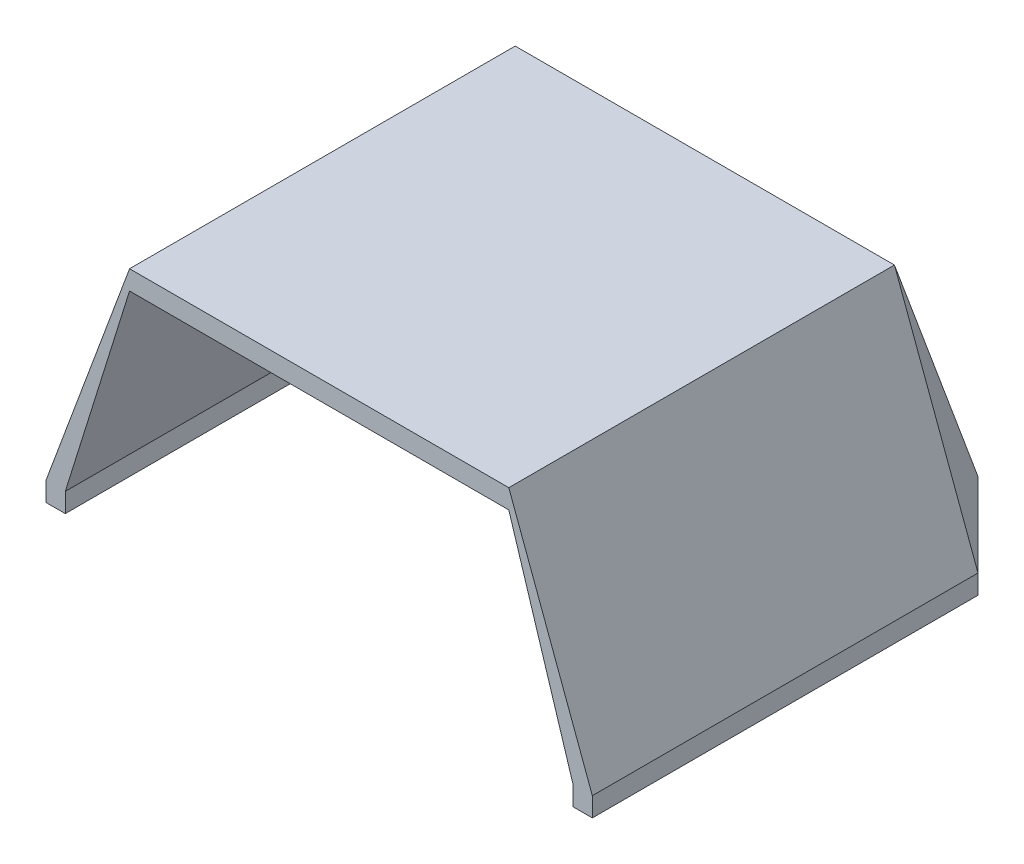
ISO-10303-21;
HEADER;
FILE_DESCRIPTION(('STEP AP214'),'2;1');
FILE_NAME('part.step','',(''),(''),'','','');
FILE_SCHEMA(('AUTOMOTIVE_DESIGN { 1 0 10303 214 1 1 1 1 }'));
ENDSEC;
DATA;
#1=APPLICATION_CONTEXT('core data for automotive mechanical design processes');
#2=APPLICATION_PROTOCOL_DEFINITION('international standard','automotive_design',2000,#1);
#3=PRODUCT_CONTEXT('',#1,'mechanical');
#4=PRODUCT('Part','Part','',(#3));
#5=PRODUCT_RELATED_PRODUCT_CATEGORY('part','',(#4));
#6=PRODUCT_DEFINITION_FORMATION('','',#4);
#7=PRODUCT_DEFINITION_CONTEXT('part definition',#1,'design');
#8=PRODUCT_DEFINITION('design','',#6,#7);
#9=PRODUCT_DEFINITION_SHAPE('','',#8);
#10=(LENGTH_UNIT() NAMED_UNIT(*) SI_UNIT(.MILLI.,.METRE.));
#11=(NAMED_UNIT(*) PLANE_ANGLE_UNIT() SI_UNIT($,.RADIAN.));
#12=(NAMED_UNIT(*) SI_UNIT($,.STERADIAN.) SOLID_ANGLE_UNIT());
#13=UNCERTAINTY_MEASURE_WITH_UNIT(LENGTH_MEASURE(1.E-05),#10,'distance_accuracy_value','');
#14=(GEOMETRIC_REPRESENTATION_CONTEXT(3) GLOBAL_UNCERTAINTY_ASSIGNED_CONTEXT((#13)) GLOBAL_UNIT_ASSIGNED_CONTEXT((#10,
#11,#12)) REPRESENTATION_CONTEXT('',''));
#15=CARTESIAN_POINT('',(0.,0.,0.));
#16=DIRECTION('',(0.,0.,1.));
#17=DIRECTION('',(1.,0.,0.));
#18=AXIS2_PLACEMENT_3D('',#15,#16,#17);
#19=CARTESIAN_POINT('',(0.,3.,-70.));
#20=DIRECTION('',(0.,0.,-1.));
#21=DIRECTION('',(-1.,0.,0.));
#22=AXIS2_PLACEMENT_3D('',#19,#20,#21);
#23=PLANE('',#22);
#24=DIRECTION('',(1.,0.,0.));
#25=VECTOR('',#24,1.);
#26=CARTESIAN_POINT('',(0.,0.,-70.));
#27=LINE('',#26,#25);
#28=CARTESIAN_POINT('',(0.,0.,-70.));
#29=VERTEX_POINT('',#28);
#30=CARTESIAN_POINT('',(59.,0.,-70.));
#31=VERTEX_POINT('',#30);
#32=EDGE_CURVE('E110',#29,#31,#27,.T.);
#33=ORIENTED_EDGE('',*,*,#32,.T.);
#34=DIRECTION('',(0.,-1.,0.));
#35=VECTOR('',#34,1.);
#36=CARTESIAN_POINT('',(59.,3.,-70.));
#37=LINE('',#36,#35);
#38=CARTESIAN_POINT('',(59.,3.,-70.));
#39=VERTEX_POINT('',#38);
#40=EDGE_CURVE('E12',#39,#31,#37,.T.);
#41=ORIENTED_EDGE('',*,*,#40,.F.);
#42=DIRECTION('',(1.,0.,0.));
#43=VECTOR('',#42,1.);
#44=CARTESIAN_POINT('',(0.,3.,-70.));
#45=LINE('',#44,#43);
#46=CARTESIAN_POINT('',(0.,3.,-70.));
#47=VERTEX_POINT('',#46);
#48=EDGE_CURVE('E109',#47,#39,#45,.T.);
#49=ORIENTED_EDGE('',*,*,#48,.F.);
#50=DIRECTION('',(0.,-1.,0.));
#51=VECTOR('',#50,1.);
#52=CARTESIAN_POINT('',(0.,3.,-70.));
#53=LINE('',#52,#51);
#54=EDGE_CURVE('E122',#47,#29,#53,.T.);
#55=ORIENTED_EDGE('',*,*,#54,.T.);
#56=EDGE_LOOP('',(#33,#41,#49,#55));
#57=FACE_BOUND('',#56,.T.);
#58=ADVANCED_FACE('F63',(#57),#23,.F.);
#59=CARTESIAN_POINT('',(0.,3.,-73.));
#60=DIRECTION('',(0.,0.,-1.));
#61=DIRECTION('',(-1.,0.,0.));
#62=AXIS2_PLACEMENT_3D('',#59,#60,#61);
#63=PLANE('',#62);
#64=DIRECTION('',(1.,0.,0.));
#65=VECTOR('',#64,1.);
#66=CARTESIAN_POINT('',(0.,0.,-73.));
#67=LINE('',#66,#65);
#68=CARTESIAN_POINT('',(0.,0.,-73.));
#69=VERTEX_POINT('',#68);
#70=CARTESIAN_POINT('',(59.,0.,-73.));
#71=VERTEX_POINT('',#70);
#72=EDGE_CURVE('E98',#69,#71,#67,.T.);
#73=ORIENTED_EDGE('',*,*,#72,.F.);
#74=DIRECTION('',(0.,-1.,0.));
#75=VECTOR('',#74,1.);
#76=CARTESIAN_POINT('',(0.,3.,-73.));
#77=LINE('',#76,#75);
#78=CARTESIAN_POINT('',(0.,3.,-73.));
#79=VERTEX_POINT('',#78);
#80=EDGE_CURVE('E101',#79,#69,#77,.T.);
#81=ORIENTED_EDGE('',*,*,#80,.F.);
#82=DIRECTION('',(1.,0.,0.));
#83=VECTOR('',#82,1.);
#84=CARTESIAN_POINT('',(0.,3.,-73.));
#85=LINE('',#84,#83);
#86=CARTESIAN_POINT('',(59.,3.,-73.));
#87=VERTEX_POINT('',#86);
#88=EDGE_CURVE('E81',#79,#87,#85,.T.);
#89=ORIENTED_EDGE('',*,*,#88,.T.);
#90=DIRECTION('',(0.,-1.,0.));
#91=VECTOR('',#90,1.);
#92=CARTESIAN_POINT('',(59.,3.,-73.));
#93=LINE('',#92,#91);
#94=EDGE_CURVE('E73',#87,#71,#93,.T.);
#95=ORIENTED_EDGE('',*,*,#94,.T.);
#96=EDGE_LOOP('',(#73,#81,#89,#95));
#97=FACE_BOUND('',#96,.T.);
#98=ADVANCED_FACE('F100',(#97),#63,.T.);
#99=CARTESIAN_POINT('',(0.,0.,0.));
#100=DIRECTION('',(0.,1.,0.));
#101=DIRECTION('',(0.,0.,1.));
#102=AXIS2_PLACEMENT_3D('',#99,#100,#101);
#103=PLANE('',#102);
#104=ORIENTED_EDGE('',*,*,#32,.F.);
#105=DIRECTION('',(0.707106781186548,0.,-0.707106781186547));
#106=VECTOR('',#105,1.);
#107=CARTESIAN_POINT('',(-10.,0.,-60.));
#108=LINE('',#107,#106);
#109=CARTESIAN_POINT('',(-10.,0.,-60.));
#110=VERTEX_POINT('',#109);
#111=EDGE_CURVE('E137',#110,#29,#108,.T.);
#112=ORIENTED_EDGE('',*,*,#111,.F.);
#113=DIRECTION('',(0.,0.,-1.));
#114=VECTOR('',#113,1.);
#115=CARTESIAN_POINT('',(-10.,0.,0.));
#116=LINE('',#115,#114);
#117=CARTESIAN_POINT('',(-10.,0.,0.));
#118=VERTEX_POINT('',#117);
#119=EDGE_CURVE('E146',#118,#110,#116,.T.);
#120=ORIENTED_EDGE('',*,*,#119,.F.);
#121=DIRECTION('',(-1.,0.,0.));
#122=VECTOR('',#121,1.);
#123=CARTESIAN_POINT('',(0.,0.,0.));
#124=LINE('',#123,#122);
#125=CARTESIAN_POINT('',(-13.,0.,0.));
#126=VERTEX_POINT('',#125);
#127=EDGE_CURVE('E143',#118,#126,#124,.T.);
#128=ORIENTED_EDGE('',*,*,#127,.T.);
#129=DIRECTION('',(0.,0.,-1.));
#130=VECTOR('',#129,1.);
#131=CARTESIAN_POINT('',(-13.,0.,0.));
#132=LINE('',#131,#130);
#133=CARTESIAN_POINT('',(-13.,0.,-60.));
#134=VERTEX_POINT('',#133);
#135=EDGE_CURVE('E129',#126,#134,#132,.T.);
#136=ORIENTED_EDGE('',*,*,#135,.T.);
#137=DIRECTION('',(0.707106781186548,0.,-0.707106781186547));
#138=VECTOR('',#137,1.);
#139=CARTESIAN_POINT('',(-13.,0.,-60.));
#140=LINE('',#139,#138);
#141=EDGE_CURVE('E118',#134,#69,#140,.T.);
#142=ORIENTED_EDGE('',*,*,#141,.T.);
#143=ORIENTED_EDGE('',*,*,#72,.T.);
#144=DIRECTION('',(0.707106781186547,0.,0.707106781186547));
#145=VECTOR('',#144,1.);
#146=CARTESIAN_POINT('',(59.,0.,-73.));
#147=LINE('',#146,#145);
#148=CARTESIAN_POINT('',(72.,0.,-60.));
#149=VERTEX_POINT('',#148);
#150=EDGE_CURVE('E331',#71,#149,#147,.T.);
#151=ORIENTED_EDGE('',*,*,#150,.T.);
#152=DIRECTION('',(0.,0.,1.));
#153=VECTOR('',#152,1.);
#154=CARTESIAN_POINT('',(72.,0.,0.));
#155=LINE('',#154,#153);
#156=CARTESIAN_POINT('',(72.,0.,0.));
#157=VERTEX_POINT('',#156);
#158=EDGE_CURVE('E387',#149,#157,#155,.T.);
#159=ORIENTED_EDGE('',*,*,#158,.T.);
#160=DIRECTION('',(1.,0.,0.));
#161=VECTOR('',#160,1.);
#162=CARTESIAN_POINT('',(0.,0.,0.));
#163=LINE('',#162,#161);
#164=CARTESIAN_POINT('',(69.,0.,0.));
#165=VERTEX_POINT('',#164);
#166=EDGE_CURVE('E379',#165,#157,#163,.T.);
#167=ORIENTED_EDGE('',*,*,#166,.F.);
#168=DIRECTION('',(0.,0.,1.));
#169=VECTOR('',#168,1.);
#170=CARTESIAN_POINT('',(69.,0.,0.));
#171=LINE('',#170,#169);
#172=CARTESIAN_POINT('',(69.,0.,-60.));
#173=VERTEX_POINT('',#172);
#174=EDGE_CURVE('E465',#173,#165,#171,.T.);
#175=ORIENTED_EDGE('',*,*,#174,.F.);
#176=DIRECTION('',(0.707106781186547,0.,0.707106781186547));
#177=VECTOR('',#176,1.);
#178=CARTESIAN_POINT('',(59.,0.,-70.));
#179=LINE('',#178,#177);
#180=EDGE_CURVE('E343',#31,#173,#179,.T.);
#181=ORIENTED_EDGE('',*,*,#180,.F.);
#182=EDGE_LOOP('',(#104,#112,#120,#128,#136,#142,#143,#151,#159,#167,#175,#181));
#183=FACE_BOUND('',#182,.T.);
#184=ADVANCED_FACE('F126',(#183),#103,.F.);
#185=CARTESIAN_POINT('',(0.,24.1908177905308,-65.12912482066));
#186=DIRECTION('',(0.,-0.348186529603627,0.937425272009765));
#187=DIRECTION('',(0.,-0.937425272009766,-0.348186529603627));
#188=AXIS2_PLACEMENT_3D('',#185,#186,#187);
#189=PLANE('',#188);
#190=DIRECTION('',(0.,-0.937425272009765,-0.348186529603627));
#191=VECTOR('',#190,1.);
#192=CARTESIAN_POINT('',(59.,24.1908177905308,-65.12912482066));
#193=LINE('',#192,#191);
#194=CARTESIAN_POINT('',(59.,38.,-60.));
#195=VERTEX_POINT('',#194);
#196=EDGE_CURVE('E315',#195,#87,#193,.T.);
#197=ORIENTED_EDGE('',*,*,#196,.T.);
#198=ORIENTED_EDGE('',*,*,#88,.F.);
#199=DIRECTION('',(0.,-0.937425272009765,-0.348186529603627));
#200=VECTOR('',#199,1.);
#201=CARTESIAN_POINT('',(0.,24.1908177905308,-65.12912482066));
#202=LINE('',#201,#200);
#203=CARTESIAN_POINT('',(0.,38.,-60.));
#204=VERTEX_POINT('',#203);
#205=EDGE_CURVE('E408',#204,#79,#202,.T.);
#206=ORIENTED_EDGE('',*,*,#205,.F.);
#207=DIRECTION('',(1.,0.,0.));
#208=VECTOR('',#207,1.);
#209=CARTESIAN_POINT('',(0.,38.,-60.));
#210=LINE('',#209,#208);
#211=EDGE_CURVE('E317',#204,#195,#210,.T.);
#212=ORIENTED_EDGE('',*,*,#211,.T.);
#213=EDGE_LOOP('',(#197,#198,#206,#212));
#214=FACE_BOUND('',#213,.T.);
#215=ADVANCED_FACE('F316',(#214),#189,.F.);
#216=CARTESIAN_POINT('',(0.,20.1957295373665,-64.6263345195729));
#217=DIRECTION('',(0.,0.298274993135947,-0.95447997803503));
#218=DIRECTION('',(0.,0.95447997803503,0.298274993135947));
#219=AXIS2_PLACEMENT_3D('',#216,#217,#218);
#220=PLANE('',#219);
#221=DIRECTION('',(0.,0.95447997803503,0.298274993135947));
#222=VECTOR('',#221,1.);
#223=CARTESIAN_POINT('',(59.,20.1957295373665,-64.6263345195729));
#224=LINE('',#223,#222);
#225=CARTESIAN_POINT('',(59.,35.,-60.));
#226=VERTEX_POINT('',#225);
#227=EDGE_CURVE('E322',#39,#226,#224,.T.);
#228=ORIENTED_EDGE('',*,*,#227,.T.);
#229=DIRECTION('',(1.,0.,0.));
#230=VECTOR('',#229,1.);
#231=CARTESIAN_POINT('',(0.,35.,-60.));
#232=LINE('',#231,#230);
#233=CARTESIAN_POINT('',(0.,35.,-60.));
#234=VERTEX_POINT('',#233);
#235=EDGE_CURVE('E399',#234,#226,#232,.T.);
#236=ORIENTED_EDGE('',*,*,#235,.F.);
#237=DIRECTION('',(0.,0.95447997803503,0.298274993135947));
#238=VECTOR('',#237,1.);
#239=CARTESIAN_POINT('',(0.,20.1957295373665,-64.6263345195729));
#240=LINE('',#239,#238);
#241=EDGE_CURVE('E405',#47,#234,#240,.T.);
#242=ORIENTED_EDGE('',*,*,#241,.F.);
#243=ORIENTED_EDGE('',*,*,#48,.T.);
#244=EDGE_LOOP('',(#228,#236,#242,#243));
#245=FACE_BOUND('',#244,.T.);
#246=ADVANCED_FACE('F427',(#245),#220,.F.);
#247=CARTESIAN_POINT('',(72.,3.,0.));
#248=DIRECTION('',(1.,0.,0.));
#249=DIRECTION('',(0.,0.,-1.));
#250=AXIS2_PLACEMENT_3D('',#247,#248,#249);
#251=PLANE('',#250);
#252=ORIENTED_EDGE('',*,*,#158,.F.);
#253=DIRECTION('',(0.,-1.,0.));
#254=VECTOR('',#253,1.);
#255=CARTESIAN_POINT('',(72.,3.,-60.));
#256=LINE('',#255,#254);
#257=CARTESIAN_POINT('',(72.,3.,-60.));
#258=VERTEX_POINT('',#257);
#259=EDGE_CURVE('E323',#258,#149,#256,.T.);
#260=ORIENTED_EDGE('',*,*,#259,.F.);
#261=DIRECTION('',(0.,0.,-1.));
#262=VECTOR('',#261,1.);
#263=CARTESIAN_POINT('',(72.,3.,0.));
#264=LINE('',#263,#262);
#265=CARTESIAN_POINT('',(72.,3.,0.));
#266=VERTEX_POINT('',#265);
#267=EDGE_CURVE('E375',#258,#266,#264,.F.);
#268=ORIENTED_EDGE('',*,*,#267,.T.);
#269=DIRECTION('',(0.,-1.,0.));
#270=VECTOR('',#269,1.);
#271=CARTESIAN_POINT('',(72.,3.,0.));
#272=LINE('',#271,#270);
#273=EDGE_CURVE('E371',#266,#157,#272,.T.);
#274=ORIENTED_EDGE('',*,*,#273,.T.);
#275=EDGE_LOOP('',(#252,#260,#268,#274));
#276=FACE_BOUND('',#275,.T.);
#277=ADVANCED_FACE('F472',(#276),#251,.T.);
#278=CARTESIAN_POINT('',(69.,3.,0.));
#279=DIRECTION('',(1.,0.,0.));
#280=DIRECTION('',(0.,0.,-1.));
#281=AXIS2_PLACEMENT_3D('',#278,#279,#280);
#282=PLANE('',#281);
#283=ORIENTED_EDGE('',*,*,#174,.T.);
#284=DIRECTION('',(0.,-1.,0.));
#285=VECTOR('',#284,1.);
#286=CARTESIAN_POINT('',(69.,3.,0.));
#287=LINE('',#286,#285);
#288=CARTESIAN_POINT('',(69.,3.,0.));
#289=VERTEX_POINT('',#288);
#290=EDGE_CURVE('E365',#289,#165,#287,.T.);
#291=ORIENTED_EDGE('',*,*,#290,.F.);
#292=DIRECTION('',(0.,0.,1.));
#293=VECTOR('',#292,1.);
#294=CARTESIAN_POINT('',(69.,3.,0.));
#295=LINE('',#294,#293);
#296=CARTESIAN_POINT('',(69.,3.,-60.));
#297=VERTEX_POINT('',#296);
#298=EDGE_CURVE('E378',#297,#289,#295,.T.);
#299=ORIENTED_EDGE('',*,*,#298,.F.);
#300=DIRECTION('',(0.,-1.,0.));
#301=VECTOR('',#300,1.);
#302=CARTESIAN_POINT('',(69.,3.,-60.));
#303=LINE('',#302,#301);
#304=EDGE_CURVE('E361',#297,#173,#303,.T.);
#305=ORIENTED_EDGE('',*,*,#304,.T.);
#306=EDGE_LOOP('',(#283,#291,#299,#305));
#307=FACE_BOUND('',#306,.T.);
#308=ADVANCED_FACE('F476',(#307),#282,.F.);
#309=CARTESIAN_POINT('',(0.,3.,0.));
#310=DIRECTION('',(0.,0.,-1.));
#311=DIRECTION('',(-1.,0.,0.));
#312=AXIS2_PLACEMENT_3D('',#309,#310,#311);
#313=PLANE('',#312);
#314=ORIENTED_EDGE('',*,*,#166,.T.);
#315=ORIENTED_EDGE('',*,*,#273,.F.);
#316=DIRECTION('',(-0.348186529603627,0.937425272009765,0.));
#317=VECTOR('',#316,1.);
#318=CARTESIAN_POINT('',(72.,3.,0.));
#319=LINE('',#318,#317);
#320=CARTESIAN_POINT('',(59.,38.,0.));
#321=VERTEX_POINT('',#320);
#322=EDGE_CURVE('E442',#266,#321,#319,.T.);
#323=ORIENTED_EDGE('',*,*,#322,.T.);
#324=DIRECTION('',(1.,0.,0.));
#325=VECTOR('',#324,1.);
#326=CARTESIAN_POINT('',(0.,38.,0.));
#327=LINE('',#326,#325);
#328=CARTESIAN_POINT('',(0.,38.,0.));
#329=VERTEX_POINT('',#328);
#330=EDGE_CURVE('E252',#329,#321,#327,.T.);
#331=ORIENTED_EDGE('',*,*,#330,.F.);
#332=DIRECTION('',(0.348186529603627,0.937425272009765,0.));
#333=VECTOR('',#332,1.);
#334=CARTESIAN_POINT('',(-13.,3.,0.));
#335=LINE('',#334,#333);
#336=CARTESIAN_POINT('',(-13.,3.,0.));
#337=VERTEX_POINT('',#336);
#338=EDGE_CURVE('E163',#337,#329,#335,.T.);
#339=ORIENTED_EDGE('',*,*,#338,.F.);
#340=DIRECTION('',(0.,-1.,0.));
#341=VECTOR('',#340,1.);
#342=CARTESIAN_POINT('',(-13.,3.,0.));
#343=LINE('',#342,#341);
#344=EDGE_CURVE('E221',#337,#126,#343,.T.);
#345=ORIENTED_EDGE('',*,*,#344,.T.);
#346=ORIENTED_EDGE('',*,*,#127,.F.);
#347=DIRECTION('',(0.,-1.,0.));
#348=VECTOR('',#347,1.);
#349=CARTESIAN_POINT('',(-10.,3.,0.));
#350=LINE('',#349,#348);
#351=CARTESIAN_POINT('',(-10.,3.,0.));
#352=VERTEX_POINT('',#351);
#353=EDGE_CURVE('E503',#352,#118,#350,.T.);
#354=ORIENTED_EDGE('',*,*,#353,.F.);
#355=DIRECTION('',(0.298274993135947,0.95447997803503,0.));
#356=VECTOR('',#355,1.);
#357=CARTESIAN_POINT('',(-10.,3.,0.));
#358=LINE('',#357,#356);
#359=CARTESIAN_POINT('',(0.,35.,0.));
#360=VERTEX_POINT('',#359);
#361=EDGE_CURVE('E156',#352,#360,#358,.T.);
#362=ORIENTED_EDGE('',*,*,#361,.T.);
#363=DIRECTION('',(1.,0.,0.));
#364=VECTOR('',#363,1.);
#365=CARTESIAN_POINT('',(0.,35.,0.));
#366=LINE('',#365,#364);
#367=CARTESIAN_POINT('',(59.,35.,0.));
#368=VERTEX_POINT('',#367);
#369=EDGE_CURVE('E155',#360,#368,#366,.T.);
#370=ORIENTED_EDGE('',*,*,#369,.T.);
#371=DIRECTION('',(-0.298274993135947,0.95447997803503,0.));
#372=VECTOR('',#371,1.);
#373=CARTESIAN_POINT('',(69.,3.,0.));
#374=LINE('',#373,#372);
#375=EDGE_CURVE('E437',#289,#368,#374,.T.);
#376=ORIENTED_EDGE('',*,*,#375,.F.);
#377=ORIENTED_EDGE('',*,*,#290,.T.);
#378=EDGE_LOOP('',(#314,#315,#323,#331,#339,#345,#346,#354,#362,#370,#376,#377));
#379=FACE_BOUND('',#378,.T.);
#380=ADVANCED_FACE('F247',(#379),#313,.F.);
#381=CARTESIAN_POINT('',(63.7153024911032,19.9110320284697,0.));
#382=DIRECTION('',(-0.95447997803503,-0.298274993135947,0.));
#383=DIRECTION('',(0.298274993135947,-0.95447997803503,0.));
#384=AXIS2_PLACEMENT_3D('',#381,#382,#383);
#385=PLANE('',#384);
#386=ORIENTED_EDGE('',*,*,#375,.T.);
#387=DIRECTION('',(0.,0.,-1.));
#388=VECTOR('',#387,1.);
#389=CARTESIAN_POINT('',(59.,35.,0.));
#390=LINE('',#389,#388);
#391=EDGE_CURVE('E388',#368,#226,#390,.T.);
#392=ORIENTED_EDGE('',*,*,#391,.T.);
#393=DIRECTION('',(-0.298274993135947,0.95447997803503,0.));
#394=VECTOR('',#393,1.);
#395=CARTESIAN_POINT('',(69.,3.,-60.));
#396=LINE('',#395,#394);
#397=EDGE_CURVE('E356',#297,#226,#396,.T.);
#398=ORIENTED_EDGE('',*,*,#397,.F.);
#399=ORIENTED_EDGE('',*,*,#298,.T.);
#400=EDGE_LOOP('',(#386,#392,#398,#399));
#401=FACE_BOUND('',#400,.T.);
#402=ADVANCED_FACE('F435',(#401),#385,.T.);
#403=CARTESIAN_POINT('',(64.2503586800574,23.864418938307,0.));
#404=DIRECTION('',(-0.937425272009765,-0.348186529603627,0.));
#405=DIRECTION('',(0.348186529603627,-0.937425272009765,0.));
#406=AXIS2_PLACEMENT_3D('',#403,#404,#405);
#407=PLANE('',#406);
#408=DIRECTION('',(-0.348186529603627,0.937425272009765,0.));
#409=VECTOR('',#408,1.);
#410=CARTESIAN_POINT('',(72.,3.,-60.));
#411=LINE('',#410,#409);
#412=EDGE_CURVE('E335',#258,#195,#411,.T.);
#413=ORIENTED_EDGE('',*,*,#412,.T.);
#414=DIRECTION('',(0.,0.,-1.));
#415=VECTOR('',#414,1.);
#416=CARTESIAN_POINT('',(59.,38.,0.));
#417=LINE('',#416,#415);
#418=EDGE_CURVE('E383',#321,#195,#417,.T.);
#419=ORIENTED_EDGE('',*,*,#418,.F.);
#420=ORIENTED_EDGE('',*,*,#322,.F.);
#421=ORIENTED_EDGE('',*,*,#267,.F.);
#422=EDGE_LOOP('',(#413,#419,#420,#421));
#423=FACE_BOUND('',#422,.T.);
#424=ADVANCED_FACE('F560',(#423),#407,.F.);
#425=CARTESIAN_POINT('',(0.,38.,0.));
#426=DIRECTION('',(0.,1.,0.));
#427=DIRECTION('',(0.,0.,1.));
#428=AXIS2_PLACEMENT_3D('',#425,#426,#427);
#429=PLANE('',#428);
#430=ORIENTED_EDGE('',*,*,#330,.T.);
#431=ORIENTED_EDGE('',*,*,#418,.T.);
#432=ORIENTED_EDGE('',*,*,#211,.F.);
#433=DIRECTION('',(0.,0.,1.));
#434=VECTOR('',#433,1.);
#435=CARTESIAN_POINT('',(0.,38.,0.));
#436=LINE('',#435,#434);
#437=EDGE_CURVE('E238',#329,#204,#436,.F.);
#438=ORIENTED_EDGE('',*,*,#437,.F.);
#439=EDGE_LOOP('',(#430,#431,#432,#438));
#440=FACE_BOUND('',#439,.T.);
#441=ADVANCED_FACE('F199',(#440),#429,.T.);
#442=CARTESIAN_POINT('',(0.,35.,0.));
#443=DIRECTION('',(0.,1.,0.));
#444=DIRECTION('',(0.,0.,1.));
#445=AXIS2_PLACEMENT_3D('',#442,#443,#444);
#446=PLANE('',#445);
#447=ORIENTED_EDGE('',*,*,#369,.F.);
#448=DIRECTION('',(0.,0.,1.));
#449=VECTOR('',#448,1.);
#450=CARTESIAN_POINT('',(0.,35.,0.));
#451=LINE('',#450,#449);
#452=EDGE_CURVE('E433',#360,#234,#451,.F.);
#453=ORIENTED_EDGE('',*,*,#452,.T.);
#454=ORIENTED_EDGE('',*,*,#235,.T.);
#455=ORIENTED_EDGE('',*,*,#391,.F.);
#456=EDGE_LOOP('',(#447,#453,#454,#455));
#457=FACE_BOUND('',#456,.T.);
#458=ADVANCED_FACE('F191',(#457),#446,.F.);
#459=CARTESIAN_POINT('',(-12.403156384505,4.60688665710187,0.));
#460=DIRECTION('',(-0.937425272009765,0.348186529603627,0.));
#461=DIRECTION('',(-0.348186529603627,-0.937425272009765,0.));
#462=AXIS2_PLACEMENT_3D('',#459,#460,#461);
#463=PLANE('',#462);
#464=ORIENTED_EDGE('',*,*,#338,.T.);
#465=ORIENTED_EDGE('',*,*,#437,.T.);
#466=DIRECTION('',(0.348186529603627,0.937425272009765,0.));
#467=VECTOR('',#466,1.);
#468=CARTESIAN_POINT('',(-13.,3.,-60.));
#469=LINE('',#468,#467);
#470=CARTESIAN_POINT('',(-13.,3.,-60.));
#471=VERTEX_POINT('',#470);
#472=EDGE_CURVE('E159',#471,#204,#469,.T.);
#473=ORIENTED_EDGE('',*,*,#472,.F.);
#474=DIRECTION('',(0.,0.,-1.));
#475=VECTOR('',#474,1.);
#476=CARTESIAN_POINT('',(-13.,3.,0.));
#477=LINE('',#476,#475);
#478=EDGE_CURVE('E173',#337,#471,#477,.T.);
#479=ORIENTED_EDGE('',*,*,#478,.F.);
#480=EDGE_LOOP('',(#464,#465,#473,#479));
#481=FACE_BOUND('',#480,.T.);
#482=ADVANCED_FACE('F180',(#481),#463,.T.);
#483=CARTESIAN_POINT('',(-9.9644128113879,3.11387900355872,0.));
#484=DIRECTION('',(-0.95447997803503,0.298274993135947,0.));
#485=DIRECTION('',(-0.298274993135947,-0.95447997803503,0.));
#486=AXIS2_PLACEMENT_3D('',#483,#484,#485);
#487=PLANE('',#486);
#488=DIRECTION('',(0.298274993135947,0.95447997803503,0.));
#489=VECTOR('',#488,1.);
#490=CARTESIAN_POINT('',(-10.,3.,-60.));
#491=LINE('',#490,#489);
#492=CARTESIAN_POINT('',(-10.,3.,-60.));
#493=VERTEX_POINT('',#492);
#494=EDGE_CURVE('E151',#493,#234,#491,.T.);
#495=ORIENTED_EDGE('',*,*,#494,.T.);
#496=ORIENTED_EDGE('',*,*,#452,.F.);
#497=ORIENTED_EDGE('',*,*,#361,.F.);
#498=DIRECTION('',(0.,0.,-1.));
#499=VECTOR('',#498,1.);
#500=CARTESIAN_POINT('',(-10.,3.,0.));
#501=LINE('',#500,#499);
#502=EDGE_CURVE('E220',#352,#493,#501,.T.);
#503=ORIENTED_EDGE('',*,*,#502,.T.);
#504=EDGE_LOOP('',(#495,#496,#497,#503));
#505=FACE_BOUND('',#504,.T.);
#506=ADVANCED_FACE('F190',(#505),#487,.F.);
#507=CARTESIAN_POINT('',(-13.,3.,0.));
#508=DIRECTION('',(-1.,0.,0.));
#509=DIRECTION('',(0.,0.,1.));
#510=AXIS2_PLACEMENT_3D('',#507,#508,#509);
#511=PLANE('',#510);
#512=ORIENTED_EDGE('',*,*,#135,.F.);
#513=ORIENTED_EDGE('',*,*,#344,.F.);
#514=ORIENTED_EDGE('',*,*,#478,.T.);
#515=DIRECTION('',(0.,-1.,0.));
#516=VECTOR('',#515,1.);
#517=CARTESIAN_POINT('',(-13.,3.,-60.));
#518=LINE('',#517,#516);
#519=EDGE_CURVE('E150',#471,#134,#518,.T.);
#520=ORIENTED_EDGE('',*,*,#519,.T.);
#521=EDGE_LOOP('',(#512,#513,#514,#520));
#522=FACE_BOUND('',#521,.T.);
#523=ADVANCED_FACE('F192',(#522),#511,.T.);
#524=CARTESIAN_POINT('',(-10.,3.,0.));
#525=DIRECTION('',(-1.,0.,0.));
#526=DIRECTION('',(0.,0.,1.));
#527=AXIS2_PLACEMENT_3D('',#524,#525,#526);
#528=PLANE('',#527);
#529=ORIENTED_EDGE('',*,*,#119,.T.);
#530=DIRECTION('',(0.,-1.,0.));
#531=VECTOR('',#530,1.);
#532=CARTESIAN_POINT('',(-10.,3.,-60.));
#533=LINE('',#532,#531);
#534=EDGE_CURVE('E499',#493,#110,#533,.T.);
#535=ORIENTED_EDGE('',*,*,#534,.F.);
#536=ORIENTED_EDGE('',*,*,#502,.F.);
#537=ORIENTED_EDGE('',*,*,#353,.T.);
#538=EDGE_LOOP('',(#529,#535,#536,#537));
#539=FACE_BOUND('',#538,.T.);
#540=ADVANCED_FACE('F529',(#539),#528,.F.);
#541=CARTESIAN_POINT('',(-35.,0.,-35.));
#542=DIRECTION('',(-0.707106781186547,0.,-0.707106781186548));
#543=DIRECTION('',(-0.707106781186548,0.,0.707106781186547));
#544=AXIS2_PLACEMENT_3D('',#541,#542,#543);
#545=PLANE('',#544);
#546=ORIENTED_EDGE('',*,*,#111,.T.);
#547=ORIENTED_EDGE('',*,*,#54,.F.);
#548=DIRECTION('',(0.707106781186548,0.,-0.707106781186547));
#549=VECTOR('',#548,1.);
#550=CARTESIAN_POINT('',(-10.,3.,-60.));
#551=LINE('',#550,#549);
#552=EDGE_CURVE('E131',#493,#47,#551,.T.);
#553=ORIENTED_EDGE('',*,*,#552,.F.);
#554=ORIENTED_EDGE('',*,*,#534,.T.);
#555=EDGE_LOOP('',(#546,#547,#553,#554));
#556=FACE_BOUND('',#555,.T.);
#557=ADVANCED_FACE('F497',(#556),#545,.F.);
#558=CARTESIAN_POINT('',(0.,35.,-60.));
#559=DIRECTION('',(0.690450963203362,-0.215765926001051,0.690450963203368));
#560=DIRECTION('',(-0.298274993135947,-0.95447997803503,0.));
#561=AXIS2_PLACEMENT_3D('',#558,#559,#560);
#562=PLANE('',#561);
#563=ORIENTED_EDGE('',*,*,#494,.F.);
#564=ORIENTED_EDGE('',*,*,#552,.T.);
#565=ORIENTED_EDGE('',*,*,#241,.T.);
#566=EDGE_LOOP('',(#563,#564,#565));
#567=FACE_BOUND('',#566,.T.);
#568=ADVANCED_FACE('F526',(#567),#562,.T.);
#569=CARTESIAN_POINT('',(-36.5,0.,-36.5));
#570=DIRECTION('',(-0.707106781186547,0.,-0.707106781186548));
#571=DIRECTION('',(-0.707106781186548,0.,0.707106781186547));
#572=AXIS2_PLACEMENT_3D('',#569,#570,#571);
#573=PLANE('',#572);
#574=DIRECTION('',(0.707106781186548,0.,-0.707106781186547));
#575=VECTOR('',#574,1.);
#576=CARTESIAN_POINT('',(-13.,3.,-60.));
#577=LINE('',#576,#575);
#578=EDGE_CURVE('E120',#471,#79,#577,.T.);
#579=ORIENTED_EDGE('',*,*,#578,.T.);
#580=ORIENTED_EDGE('',*,*,#80,.T.);
#581=ORIENTED_EDGE('',*,*,#141,.F.);
#582=ORIENTED_EDGE('',*,*,#519,.F.);
#583=EDGE_LOOP('',(#579,#580,#581,#582));
#584=FACE_BOUND('',#583,.T.);
#585=ADVANCED_FACE('F115',(#584),#573,.T.);
#586=CARTESIAN_POINT('',(-13.,3.,-60.));
#587=DIRECTION('',(-0.683912112053974,0.254024498762905,-0.683912112053974));
#588=DIRECTION('',(0.348186529603627,0.937425272009765,0.));
#589=AXIS2_PLACEMENT_3D('',#586,#587,#588);
#590=PLANE('',#589);
#591=ORIENTED_EDGE('',*,*,#472,.T.);
#592=ORIENTED_EDGE('',*,*,#205,.T.);
#593=ORIENTED_EDGE('',*,*,#578,.F.);
#594=EDGE_LOOP('',(#591,#592,#593));
#595=FACE_BOUND('',#594,.T.);
#596=ADVANCED_FACE('F519',(#595),#590,.T.);
#597=CARTESIAN_POINT('',(64.5,0.,-64.5));
#598=DIRECTION('',(0.707106781186548,0.,-0.707106781186548));
#599=DIRECTION('',(-0.707106781186548,0.,-0.707106781186548));
#600=AXIS2_PLACEMENT_3D('',#597,#598,#599);
#601=PLANE('',#600);
#602=ORIENTED_EDGE('',*,*,#180,.T.);
#603=ORIENTED_EDGE('',*,*,#304,.F.);
#604=DIRECTION('',(0.707106781186548,0.,0.707106781186547));
#605=VECTOR('',#604,1.);
#606=CARTESIAN_POINT('',(59.,3.,-70.));
#607=LINE('',#606,#605);
#608=EDGE_CURVE('E340',#39,#297,#607,.T.);
#609=ORIENTED_EDGE('',*,*,#608,.F.);
#610=ORIENTED_EDGE('',*,*,#40,.T.);
#611=EDGE_LOOP('',(#602,#603,#609,#610));
#612=FACE_BOUND('',#611,.T.);
#613=ADVANCED_FACE('F359',(#612),#601,.F.);
#614=CARTESIAN_POINT('',(59.,35.,-60.));
#615=DIRECTION('',(-0.690450963203367,-0.215765926001051,0.690450963203363));
#616=DIRECTION('',(0.,-0.95447997803503,-0.298274993135947));
#617=AXIS2_PLACEMENT_3D('',#614,#615,#616);
#618=PLANE('',#617);
#619=ORIENTED_EDGE('',*,*,#227,.F.);
#620=ORIENTED_EDGE('',*,*,#608,.T.);
#621=ORIENTED_EDGE('',*,*,#397,.T.);
#622=EDGE_LOOP('',(#619,#620,#621));
#623=FACE_BOUND('',#622,.T.);
#624=ADVANCED_FACE('F353',(#623),#618,.T.);
#625=CARTESIAN_POINT('',(66.,0.,-66.));
#626=DIRECTION('',(0.707106781186548,0.,-0.707106781186548));
#627=DIRECTION('',(-0.707106781186548,0.,-0.707106781186548));
#628=AXIS2_PLACEMENT_3D('',#625,#626,#627);
#629=PLANE('',#628);
#630=DIRECTION('',(0.707106781186547,0.,0.707106781186547));
#631=VECTOR('',#630,1.);
#632=CARTESIAN_POINT('',(59.,3.,-73.));
#633=LINE('',#632,#631);
#634=EDGE_CURVE('E330',#87,#258,#633,.T.);
#635=ORIENTED_EDGE('',*,*,#634,.T.);
#636=ORIENTED_EDGE('',*,*,#259,.T.);
#637=ORIENTED_EDGE('',*,*,#150,.F.);
#638=ORIENTED_EDGE('',*,*,#94,.F.);
#639=EDGE_LOOP('',(#635,#636,#637,#638));
#640=FACE_BOUND('',#639,.T.);
#641=ADVANCED_FACE('F328',(#640),#629,.T.);
#642=CARTESIAN_POINT('',(59.,3.,-73.));
#643=DIRECTION('',(0.683912112053974,0.254024498762905,-0.683912112053974));
#644=DIRECTION('',(0.,0.937425272009765,0.348186529603627));
#645=AXIS2_PLACEMENT_3D('',#642,#643,#644);
#646=PLANE('',#645);
#647=ORIENTED_EDGE('',*,*,#196,.F.);
#648=ORIENTED_EDGE('',*,*,#412,.F.);
#649=ORIENTED_EDGE('',*,*,#634,.F.);
#650=EDGE_LOOP('',(#647,#648,#649));
#651=FACE_BOUND('',#650,.T.);
#652=ADVANCED_FACE('F334',(#651),#646,.T.);
#653=CLOSED_SHELL('',(#58,#98,#184,#215,#246,#277,#308,#380,#402,#424,#441,#458,#482,#506,#523,
#540,#557,#568,#585,#596,#613,#624,#641,#652));
#654=MANIFOLD_SOLID_BREP('B2',#653);
#655=ADVANCED_BREP_SHAPE_REPRESENTATION('',(#18,#654),#14);
#656=SHAPE_DEFINITION_REPRESENTATION(#9,#655);
ENDSEC;
END-ISO-10303-21;
